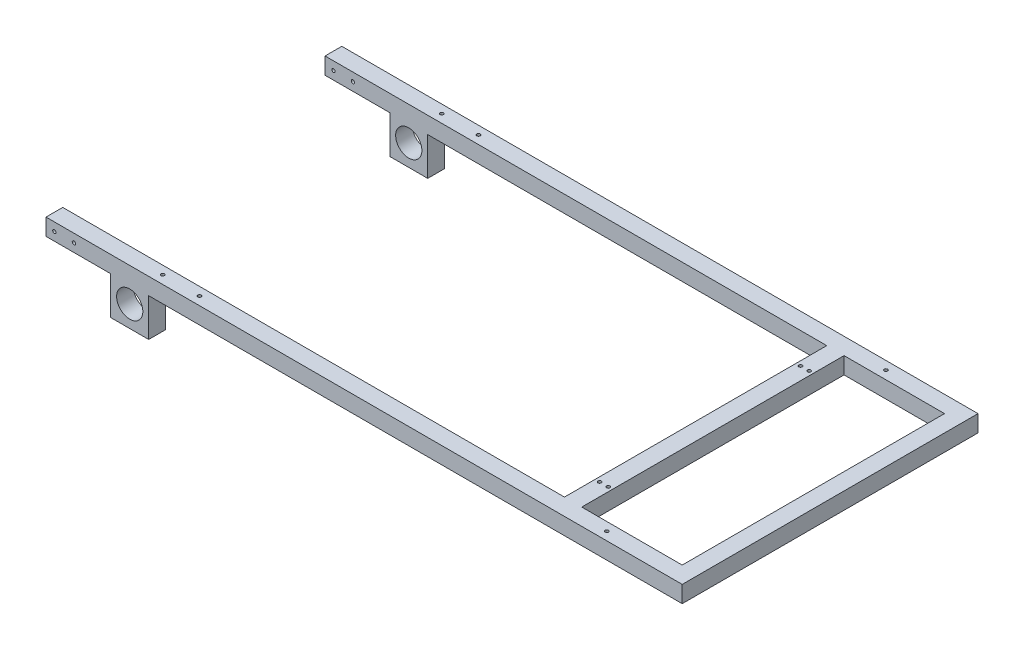
ISO-10303-21;
HEADER;
FILE_DESCRIPTION(('STEP AP214'),'2;1');
FILE_NAME('part.step','',(''),(''),'','','');
FILE_SCHEMA(('AUTOMOTIVE_DESIGN { 1 0 10303 214 1 1 1 1 }'));
ENDSEC;
DATA;
#1=APPLICATION_CONTEXT('core data for automotive mechanical design processes');
#2=APPLICATION_PROTOCOL_DEFINITION('international standard','automotive_design',2000,#1);
#3=PRODUCT_CONTEXT('',#1,'mechanical');
#4=PRODUCT('Part','Part','',(#3));
#5=PRODUCT_RELATED_PRODUCT_CATEGORY('part','',(#4));
#6=PRODUCT_DEFINITION_FORMATION('','',#4);
#7=PRODUCT_DEFINITION_CONTEXT('part definition',#1,'design');
#8=PRODUCT_DEFINITION('design','',#6,#7);
#9=PRODUCT_DEFINITION_SHAPE('','',#8);
#10=(LENGTH_UNIT() NAMED_UNIT(*) SI_UNIT(.MILLI.,.METRE.));
#11=(NAMED_UNIT(*) PLANE_ANGLE_UNIT() SI_UNIT($,.RADIAN.));
#12=(NAMED_UNIT(*) SI_UNIT($,.STERADIAN.) SOLID_ANGLE_UNIT());
#13=UNCERTAINTY_MEASURE_WITH_UNIT(LENGTH_MEASURE(1.E-05),#10,'distance_accuracy_value','');
#14=(GEOMETRIC_REPRESENTATION_CONTEXT(3) GLOBAL_UNCERTAINTY_ASSIGNED_CONTEXT((#13)) GLOBAL_UNIT_ASSIGNED_CONTEXT((#10,
#11,#12)) REPRESENTATION_CONTEXT('',''));
#15=CARTESIAN_POINT('',(0.,0.,0.));
#16=DIRECTION('',(0.,0.,1.));
#17=DIRECTION('',(1.,0.,0.));
#18=AXIS2_PLACEMENT_3D('',#15,#16,#17);
#19=CARTESIAN_POINT('',(0.,0.,0.));
#20=DIRECTION('',(0.,1.,0.));
#21=DIRECTION('',(0.,0.,1.));
#22=AXIS2_PLACEMENT_3D('',#19,#20,#21);
#23=PLANE('',#22);
#24=DIRECTION('',(1.,0.,0.));
#25=VECTOR('',#24,1.);
#26=CARTESIAN_POINT('',(-989.999999999999,0.,265.));
#27=LINE('',#26,#25);
#28=CARTESIAN_POINT('',(-150.,0.,265.));
#29=VERTEX_POINT('',#28);
#30=CARTESIAN_POINT('',(-34.,0.,265.));
#31=VERTEX_POINT('',#30);
#32=EDGE_CURVE('E205',#29,#31,#27,.T.);
#33=ORIENTED_EDGE('',*,*,#32,.F.);
#34=DIRECTION('',(0.,0.,1.));
#35=VECTOR('',#34,1.);
#36=CARTESIAN_POINT('',(-150.,0.,-265.));
#37=LINE('',#36,#35);
#38=CARTESIAN_POINT('',(-150.,0.,235.));
#39=VERTEX_POINT('',#38);
#40=EDGE_CURVE('E61',#39,#29,#37,.T.);
#41=ORIENTED_EDGE('',*,*,#40,.F.);
#42=DIRECTION('',(1.,0.,0.));
#43=VECTOR('',#42,1.);
#44=CARTESIAN_POINT('',(-959.999999999999,0.,235.));
#45=LINE('',#44,#43);
#46=CARTESIAN_POINT('',(-34.,0.,235.));
#47=VERTEX_POINT('',#46);
#48=EDGE_CURVE('E341',#39,#47,#45,.T.);
#49=ORIENTED_EDGE('',*,*,#48,.T.);
#50=DIRECTION('',(0.,0.,-1.));
#51=VECTOR('',#50,1.);
#52=CARTESIAN_POINT('',(-34.,0.,265.));
#53=LINE('',#52,#51);
#54=EDGE_CURVE('E310',#31,#47,#53,.T.);
#55=ORIENTED_EDGE('',*,*,#54,.F.);
#56=EDGE_LOOP('',(#33,#41,#49,#55));
#57=FACE_BOUND('',#56,.T.);
#58=ADVANCED_FACE('F36',(#57),#23,.F.);
#59=CARTESIAN_POINT('',(-959.999999999999,30.,-235.));
#60=DIRECTION('',(0.,0.,1.));
#61=DIRECTION('',(1.,0.,0.));
#62=AXIS2_PLACEMENT_3D('',#59,#60,#61);
#63=PLANE('',#62);
#64=CARTESIAN_POINT('',(-135.,15.,-235.));
#65=DIRECTION('',(0.,0.,1.));
#66=DIRECTION('',(1.,0.,0.));
#67=AXIS2_PLACEMENT_3D('',#64,#65,#66);
#68=CIRCLE('',#67,2.99999999999999);
#69=CARTESIAN_POINT('',(-132.,15.,-235.));
#70=VERTEX_POINT('',#69);
#71=EDGE_CURVE('E853',#70,#70,#68,.T.);
#72=ORIENTED_EDGE('',*,*,#71,.F.);
#73=EDGE_LOOP('',(#72));
#74=FACE_BOUND('',#73,.T.);
#75=CARTESIAN_POINT('',(-100.,15.,-235.));
#76=DIRECTION('',(0.,0.,1.));
#77=DIRECTION('',(1.,0.,0.));
#78=AXIS2_PLACEMENT_3D('',#75,#76,#77);
#79=CIRCLE('',#78,2.99999999999999);
#80=CARTESIAN_POINT('',(-97.,15.,-235.));
#81=VERTEX_POINT('',#80);
#82=EDGE_CURVE('E507',#81,#81,#79,.T.);
#83=ORIENTED_EDGE('',*,*,#82,.F.);
#84=EDGE_LOOP('',(#83));
#85=FACE_BOUND('',#84,.T.);
#86=DIRECTION('',(0.,1.,0.));
#87=VECTOR('',#86,1.);
#88=CARTESIAN_POINT('',(-150.,30.,-235.));
#89=LINE('',#88,#87);
#90=CARTESIAN_POINT('',(-150.,0.,-235.));
#91=VERTEX_POINT('',#90);
#92=CARTESIAN_POINT('',(-150.,30.,-235.));
#93=VERTEX_POINT('',#92);
#94=EDGE_CURVE('E229',#91,#93,#89,.T.);
#95=ORIENTED_EDGE('',*,*,#94,.F.);
#96=DIRECTION('',(-1.,0.,0.));
#97=VECTOR('',#96,1.);
#98=CARTESIAN_POINT('',(-959.999999999999,0.,-235.));
#99=LINE('',#98,#97);
#100=CARTESIAN_POINT('',(-34.,0.,-235.));
#101=VERTEX_POINT('',#100);
#102=EDGE_CURVE('E188',#101,#91,#99,.T.);
#103=ORIENTED_EDGE('',*,*,#102,.F.);
#104=DIRECTION('',(0.,1.,0.));
#105=VECTOR('',#104,1.);
#106=CARTESIAN_POINT('',(-34.,-68.,-235.));
#107=LINE('',#106,#105);
#108=CARTESIAN_POINT('',(-34.,-68.,-235.));
#109=VERTEX_POINT('',#108);
#110=EDGE_CURVE('E297',#109,#101,#107,.T.);
#111=ORIENTED_EDGE('',*,*,#110,.F.);
#112=DIRECTION('',(-1.,0.,0.));
#113=VECTOR('',#112,1.);
#114=CARTESIAN_POINT('',(-34.,-68.,-235.));
#115=LINE('',#114,#113);
#116=CARTESIAN_POINT('',(34.,-68.,-235.));
#117=VERTEX_POINT('',#116);
#118=EDGE_CURVE('E295',#117,#109,#115,.T.);
#119=ORIENTED_EDGE('',*,*,#118,.F.);
#120=DIRECTION('',(0.,1.,0.));
#121=VECTOR('',#120,1.);
#122=CARTESIAN_POINT('',(34.,-68.,-235.));
#123=LINE('',#122,#121);
#124=CARTESIAN_POINT('',(33.9999999999999,0.,-235.));
#125=VERTEX_POINT('',#124);
#126=EDGE_CURVE('E303',#117,#125,#123,.T.);
#127=ORIENTED_EDGE('',*,*,#126,.T.);
#128=CARTESIAN_POINT('',(749.000000000001,0.,-235.));
#129=VERTEX_POINT('',#128);
#130=EDGE_CURVE('E355',#129,#125,#99,.T.);
#131=ORIENTED_EDGE('',*,*,#130,.F.);
#132=DIRECTION('',(0.,1.,0.));
#133=VECTOR('',#132,1.);
#134=CARTESIAN_POINT('',(749.000000000001,-471.021230943999,-235.));
#135=LINE('',#134,#133);
#136=CARTESIAN_POINT('',(749.000000000001,30.,-235.));
#137=VERTEX_POINT('',#136);
#138=EDGE_CURVE('E261',#129,#137,#135,.T.);
#139=ORIENTED_EDGE('',*,*,#138,.T.);
#140=DIRECTION('',(-1.,0.,0.));
#141=VECTOR('',#140,1.);
#142=CARTESIAN_POINT('',(-959.999999999999,30.,-235.));
#143=LINE('',#142,#141);
#144=EDGE_CURVE('E340',#137,#93,#143,.T.);
#145=ORIENTED_EDGE('',*,*,#144,.T.);
#146=EDGE_LOOP('',(#95,#103,#111,#119,#127,#131,#139,#145));
#147=FACE_BOUND('',#146,.T.);
#148=CARTESIAN_POINT('',(0.,-30.,-235.));
#149=DIRECTION('',(0.,0.,1.));
#150=DIRECTION('',(1.,0.,0.));
#151=AXIS2_PLACEMENT_3D('',#148,#149,#150);
#152=CIRCLE('',#151,23.5);
#153=CARTESIAN_POINT('',(23.5,-30.,-235.));
#154=VERTEX_POINT('',#153);
#155=EDGE_CURVE('E213',#154,#154,#152,.T.);
#156=ORIENTED_EDGE('',*,*,#155,.F.);
#157=EDGE_LOOP('',(#156));
#158=FACE_BOUND('',#157,.T.);
#159=ADVANCED_FACE('F384',(#74,#85,#147,#158),#63,.T.);
#160=CARTESIAN_POINT('',(-959.999999999999,30.,235.));
#161=DIRECTION('',(0.,0.,-1.));
#162=DIRECTION('',(-1.,0.,0.));
#163=AXIS2_PLACEMENT_3D('',#160,#161,#162);
#164=PLANE('',#163);
#165=CARTESIAN_POINT('',(-135.,15.,235.));
#166=DIRECTION('',(0.,0.,-1.));
#167=DIRECTION('',(-1.,0.,0.));
#168=AXIS2_PLACEMENT_3D('',#165,#166,#167);
#169=CIRCLE('',#168,2.99999999999999);
#170=CARTESIAN_POINT('',(-138.,15.,235.));
#171=VERTEX_POINT('',#170);
#172=EDGE_CURVE('E846',#171,#171,#169,.T.);
#173=ORIENTED_EDGE('',*,*,#172,.F.);
#174=EDGE_LOOP('',(#173));
#175=FACE_BOUND('',#174,.T.);
#176=CARTESIAN_POINT('',(-100.,15.,235.));
#177=DIRECTION('',(0.,0.,-1.));
#178=DIRECTION('',(-1.,0.,0.));
#179=AXIS2_PLACEMENT_3D('',#176,#177,#178);
#180=CIRCLE('',#179,2.99999999999999);
#181=CARTESIAN_POINT('',(-103.,15.,235.));
#182=VERTEX_POINT('',#181);
#183=EDGE_CURVE('E503',#182,#182,#180,.T.);
#184=ORIENTED_EDGE('',*,*,#183,.F.);
#185=EDGE_LOOP('',(#184));
#186=FACE_BOUND('',#185,.T.);
#187=DIRECTION('',(0.,-1.,0.));
#188=VECTOR('',#187,1.);
#189=CARTESIAN_POINT('',(-150.,30.,235.));
#190=LINE('',#189,#188);
#191=CARTESIAN_POINT('',(-150.,30.,235.));
#192=VERTEX_POINT('',#191);
#193=EDGE_CURVE('E381',#192,#39,#190,.T.);
#194=ORIENTED_EDGE('',*,*,#193,.F.);
#195=DIRECTION('',(1.,0.,0.));
#196=VECTOR('',#195,1.);
#197=CARTESIAN_POINT('',(-959.999999999999,30.,235.));
#198=LINE('',#197,#196);
#199=CARTESIAN_POINT('',(749.000000000001,30.,235.));
#200=VERTEX_POINT('',#199);
#201=EDGE_CURVE('E346',#192,#200,#198,.T.);
#202=ORIENTED_EDGE('',*,*,#201,.T.);
#203=DIRECTION('',(0.,1.,0.));
#204=VECTOR('',#203,1.);
#205=CARTESIAN_POINT('',(749.000000000001,-471.021230943999,235.));
#206=LINE('',#205,#204);
#207=CARTESIAN_POINT('',(749.000000000001,0.,235.));
#208=VERTEX_POINT('',#207);
#209=EDGE_CURVE('E270',#208,#200,#206,.T.);
#210=ORIENTED_EDGE('',*,*,#209,.F.);
#211=CARTESIAN_POINT('',(33.9999999999999,0.,235.));
#212=VERTEX_POINT('',#211);
#213=EDGE_CURVE('E357',#212,#208,#45,.T.);
#214=ORIENTED_EDGE('',*,*,#213,.F.);
#215=DIRECTION('',(0.,1.,0.));
#216=VECTOR('',#215,1.);
#217=CARTESIAN_POINT('',(33.9999999999999,-68.,235.));
#218=LINE('',#217,#216);
#219=CARTESIAN_POINT('',(33.9999999999999,-68.,235.));
#220=VERTEX_POINT('',#219);
#221=EDGE_CURVE('E331',#220,#212,#218,.T.);
#222=ORIENTED_EDGE('',*,*,#221,.F.);
#223=DIRECTION('',(1.,0.,0.));
#224=VECTOR('',#223,1.);
#225=CARTESIAN_POINT('',(-34.,-68.,235.));
#226=LINE('',#225,#224);
#227=CARTESIAN_POINT('',(-34.,-68.,235.));
#228=VERTEX_POINT('',#227);
#229=EDGE_CURVE('E314',#228,#220,#226,.T.);
#230=ORIENTED_EDGE('',*,*,#229,.F.);
#231=DIRECTION('',(0.,1.,0.));
#232=VECTOR('',#231,1.);
#233=CARTESIAN_POINT('',(-34.,-68.,235.));
#234=LINE('',#233,#232);
#235=EDGE_CURVE('E334',#228,#47,#234,.T.);
#236=ORIENTED_EDGE('',*,*,#235,.T.);
#237=ORIENTED_EDGE('',*,*,#48,.F.);
#238=EDGE_LOOP('',(#194,#202,#210,#214,#222,#230,#236,#237));
#239=FACE_BOUND('',#238,.T.);
#240=CARTESIAN_POINT('',(0.,-30.,235.));
#241=DIRECTION('',(0.,0.,-1.));
#242=DIRECTION('',(-1.,0.,0.));
#243=AXIS2_PLACEMENT_3D('',#240,#241,#242);
#244=CIRCLE('',#243,23.5);
#245=CARTESIAN_POINT('',(-23.5,-30.,235.));
#246=VERTEX_POINT('',#245);
#247=EDGE_CURVE('E211',#246,#246,#244,.T.);
#248=ORIENTED_EDGE('',*,*,#247,.F.);
#249=EDGE_LOOP('',(#248));
#250=FACE_BOUND('',#249,.T.);
#251=ADVANCED_FACE('F434',(#175,#186,#239,#250),#164,.T.);
#252=ORIENTED_EDGE('',*,*,#102,.T.);
#253=CARTESIAN_POINT('',(-150.,0.,-265.));
#254=VERTEX_POINT('',#253);
#255=EDGE_CURVE('E175',#254,#91,#37,.T.);
#256=ORIENTED_EDGE('',*,*,#255,.F.);
#257=DIRECTION('',(-1.,0.,0.));
#258=VECTOR('',#257,1.);
#259=CARTESIAN_POINT('',(-990.,0.,-265.));
#260=LINE('',#259,#258);
#261=CARTESIAN_POINT('',(-34.,0.,-265.));
#262=VERTEX_POINT('',#261);
#263=EDGE_CURVE('E186',#262,#254,#260,.T.);
#264=ORIENTED_EDGE('',*,*,#263,.F.);
#265=DIRECTION('',(0.,0.,-1.));
#266=VECTOR('',#265,1.);
#267=CARTESIAN_POINT('',(-34.,0.,-235.));
#268=LINE('',#267,#266);
#269=EDGE_CURVE('E286',#101,#262,#268,.T.);
#270=ORIENTED_EDGE('',*,*,#269,.F.);
#271=EDGE_LOOP('',(#252,#256,#264,#270));
#272=FACE_BOUND('',#271,.T.);
#273=ADVANCED_FACE('F184',(#272),#23,.F.);
#274=CARTESIAN_POINT('',(43.9999999999996,0.,-250.));
#275=DIRECTION('',(0.,1.,0.));
#276=DIRECTION('',(0.,0.,1.));
#277=AXIS2_PLACEMENT_3D('',#274,#275,#276);
#278=CIRCLE('',#277,2.99999999999999);
#279=CARTESIAN_POINT('',(43.9999999999996,0.,-247.));
#280=VERTEX_POINT('',#279);
#281=EDGE_CURVE('E856',#280,#280,#278,.T.);
#282=ORIENTED_EDGE('',*,*,#281,.T.);
#283=EDGE_LOOP('',(#282));
#284=FACE_BOUND('',#283,.T.);
#285=CARTESIAN_POINT('',(110.,0.,-250.));
#286=DIRECTION('',(0.,1.,0.));
#287=DIRECTION('',(0.,0.,1.));
#288=AXIS2_PLACEMENT_3D('',#285,#286,#287);
#289=CIRCLE('',#288,3.00000000000001);
#290=CARTESIAN_POINT('',(110.,0.,-247.));
#291=VERTEX_POINT('',#290);
#292=EDGE_CURVE('E858',#291,#291,#289,.T.);
#293=ORIENTED_EDGE('',*,*,#292,.T.);
#294=EDGE_LOOP('',(#293));
#295=FACE_BOUND('',#294,.T.);
#296=CARTESIAN_POINT('',(43.9999999999996,0.,250.));
#297=DIRECTION('',(0.,-1.,0.));
#298=DIRECTION('',(0.,0.,-1.));
#299=AXIS2_PLACEMENT_3D('',#296,#297,#298);
#300=CIRCLE('',#299,2.99999999999999);
#301=CARTESIAN_POINT('',(43.9999999999996,0.,247.));
#302=VERTEX_POINT('',#301);
#303=EDGE_CURVE('E499',#302,#302,#300,.T.);
#304=ORIENTED_EDGE('',*,*,#303,.F.);
#305=EDGE_LOOP('',(#304));
#306=FACE_BOUND('',#305,.T.);
#307=CARTESIAN_POINT('',(110.,0.,250.));
#308=DIRECTION('',(0.,-1.,0.));
#309=DIRECTION('',(0.,0.,-1.));
#310=AXIS2_PLACEMENT_3D('',#307,#308,#309);
#311=CIRCLE('',#310,3.00000000000001);
#312=CARTESIAN_POINT('',(110.,0.,247.));
#313=VERTEX_POINT('',#312);
#314=EDGE_CURVE('E491',#313,#313,#311,.T.);
#315=ORIENTED_EDGE('',*,*,#314,.F.);
#316=EDGE_LOOP('',(#315));
#317=FACE_BOUND('',#316,.T.);
#318=CARTESIAN_POINT('',(840.000000000001,0.,-250.));
#319=DIRECTION('',(0.,1.,0.));
#320=DIRECTION('',(0.,0.,1.));
#321=AXIS2_PLACEMENT_3D('',#318,#319,#320);
#322=CIRCLE('',#321,3.00000000000005);
#323=CARTESIAN_POINT('',(840.000000000001,0.,-247.));
#324=VERTEX_POINT('',#323);
#325=EDGE_CURVE('E218',#324,#324,#322,.F.);
#326=ORIENTED_EDGE('',*,*,#325,.F.);
#327=EDGE_LOOP('',(#326));
#328=FACE_BOUND('',#327,.T.);
#329=CARTESIAN_POINT('',(840.000000000001,0.,250.));
#330=DIRECTION('',(0.,1.,0.));
#331=DIRECTION('',(0.,0.,1.));
#332=AXIS2_PLACEMENT_3D('',#329,#330,#331);
#333=CIRCLE('',#332,3.00000000000005);
#334=CARTESIAN_POINT('',(840.000000000001,0.,253.));
#335=VERTEX_POINT('',#334);
#336=EDGE_CURVE('E217',#335,#335,#333,.T.);
#337=ORIENTED_EDGE('',*,*,#336,.T.);
#338=EDGE_LOOP('',(#337));
#339=FACE_BOUND('',#338,.T.);
#340=CARTESIAN_POINT('',(772.500000000001,0.,-180.));
#341=DIRECTION('',(0.,1.,0.));
#342=DIRECTION('',(0.,0.,1.));
#343=AXIS2_PLACEMENT_3D('',#340,#341,#342);
#344=CIRCLE('',#343,3.00000000000005);
#345=CARTESIAN_POINT('',(772.500000000001,0.,-177.));
#346=VERTEX_POINT('',#345);
#347=EDGE_CURVE('E247',#346,#346,#344,.T.);
#348=ORIENTED_EDGE('',*,*,#347,.T.);
#349=EDGE_LOOP('',(#348));
#350=FACE_BOUND('',#349,.T.);
#351=CARTESIAN_POINT('',(757.000000000001,0.,180.));
#352=DIRECTION('',(0.,1.,0.));
#353=DIRECTION('',(0.,0.,1.));
#354=AXIS2_PLACEMENT_3D('',#351,#352,#353);
#355=CIRCLE('',#354,3.00000000000005);
#356=CARTESIAN_POINT('',(757.000000000001,0.,183.));
#357=VERTEX_POINT('',#356);
#358=EDGE_CURVE('E244',#357,#357,#355,.T.);
#359=ORIENTED_EDGE('',*,*,#358,.T.);
#360=EDGE_LOOP('',(#359));
#361=FACE_BOUND('',#360,.T.);
#362=CARTESIAN_POINT('',(772.500000000001,0.,180.));
#363=DIRECTION('',(0.,1.,0.));
#364=DIRECTION('',(0.,0.,1.));
#365=AXIS2_PLACEMENT_3D('',#362,#363,#364);
#366=CIRCLE('',#365,3.00000000000005);
#367=CARTESIAN_POINT('',(772.500000000001,0.,183.));
#368=VERTEX_POINT('',#367);
#369=EDGE_CURVE('E236',#368,#368,#366,.T.);
#370=ORIENTED_EDGE('',*,*,#369,.T.);
#371=EDGE_LOOP('',(#370));
#372=FACE_BOUND('',#371,.T.);
#373=CARTESIAN_POINT('',(757.000000000001,0.,-180.));
#374=DIRECTION('',(0.,1.,0.));
#375=DIRECTION('',(0.,0.,1.));
#376=AXIS2_PLACEMENT_3D('',#373,#374,#375);
#377=CIRCLE('',#376,3.00000000000005);
#378=CARTESIAN_POINT('',(757.000000000001,0.,-177.));
#379=VERTEX_POINT('',#378);
#380=EDGE_CURVE('E253',#379,#379,#377,.T.);
#381=ORIENTED_EDGE('',*,*,#380,.T.);
#382=EDGE_LOOP('',(#381));
#383=FACE_BOUND('',#382,.T.);
#384=CARTESIAN_POINT('',(960.000000000001,0.,-235.));
#385=VERTEX_POINT('',#384);
#386=CARTESIAN_POINT('',(780.000000000001,0.,-235.));
#387=VERTEX_POINT('',#386);
#388=EDGE_CURVE('E351',#385,#387,#99,.T.);
#389=ORIENTED_EDGE('',*,*,#388,.T.);
#390=DIRECTION('',(0.,0.,1.));
#391=VECTOR('',#390,1.);
#392=CARTESIAN_POINT('',(780.000000000001,0.,-235.));
#393=LINE('',#392,#391);
#394=CARTESIAN_POINT('',(780.000000000001,0.,235.));
#395=VERTEX_POINT('',#394);
#396=EDGE_CURVE('E257',#387,#395,#393,.T.);
#397=ORIENTED_EDGE('',*,*,#396,.T.);
#398=CARTESIAN_POINT('',(960.000000000001,0.,235.));
#399=VERTEX_POINT('',#398);
#400=EDGE_CURVE('E354',#395,#399,#45,.T.);
#401=ORIENTED_EDGE('',*,*,#400,.T.);
#402=DIRECTION('',(0.,0.,-1.));
#403=VECTOR('',#402,1.);
#404=CARTESIAN_POINT('',(960.000000000001,0.,-235.));
#405=LINE('',#404,#403);
#406=EDGE_CURVE('E337',#399,#385,#405,.T.);
#407=ORIENTED_EDGE('',*,*,#406,.T.);
#408=EDGE_LOOP('',(#389,#397,#401,#407));
#409=FACE_BOUND('',#408,.T.);
#410=DIRECTION('',(0.,0.,1.));
#411=VECTOR('',#410,1.);
#412=CARTESIAN_POINT('',(34.,0.,-235.));
#413=LINE('',#412,#411);
#414=CARTESIAN_POINT('',(34.,0.,-265.));
#415=VERTEX_POINT('',#414);
#416=EDGE_CURVE('E291',#415,#125,#413,.T.);
#417=ORIENTED_EDGE('',*,*,#416,.F.);
#418=CARTESIAN_POINT('',(990.,0.,-265.));
#419=VERTEX_POINT('',#418);
#420=EDGE_CURVE('E195',#419,#415,#260,.T.);
#421=ORIENTED_EDGE('',*,*,#420,.F.);
#422=DIRECTION('',(0.,0.,-1.));
#423=VECTOR('',#422,1.);
#424=CARTESIAN_POINT('',(990.,0.,-265.));
#425=LINE('',#424,#423);
#426=CARTESIAN_POINT('',(990.000000000001,0.,265.));
#427=VERTEX_POINT('',#426);
#428=EDGE_CURVE('E196',#427,#419,#425,.T.);
#429=ORIENTED_EDGE('',*,*,#428,.F.);
#430=CARTESIAN_POINT('',(34.,0.,265.));
#431=VERTEX_POINT('',#430);
#432=EDGE_CURVE('E199',#431,#427,#27,.T.);
#433=ORIENTED_EDGE('',*,*,#432,.F.);
#434=DIRECTION('',(0.,0.,1.));
#435=VECTOR('',#434,1.);
#436=CARTESIAN_POINT('',(34.,0.,265.));
#437=LINE('',#436,#435);
#438=EDGE_CURVE('E315',#212,#431,#437,.T.);
#439=ORIENTED_EDGE('',*,*,#438,.F.);
#440=ORIENTED_EDGE('',*,*,#213,.T.);
#441=DIRECTION('',(0.,0.,-1.));
#442=VECTOR('',#441,1.);
#443=CARTESIAN_POINT('',(749.000000000001,0.,-235.));
#444=LINE('',#443,#442);
#445=EDGE_CURVE('E260',#208,#129,#444,.T.);
#446=ORIENTED_EDGE('',*,*,#445,.T.);
#447=ORIENTED_EDGE('',*,*,#130,.T.);
#448=EDGE_LOOP('',(#417,#421,#429,#433,#439,#440,#446,#447));
#449=FACE_BOUND('',#448,.T.);
#450=ADVANCED_FACE('F392',(#284,#295,#306,#317,#328,#339,#350,#361,#372,#383,#409,#449),#23,.F.);
#451=CARTESIAN_POINT('',(0.,30.,0.));
#452=DIRECTION('',(0.,1.,0.));
#453=DIRECTION('',(0.,0.,1.));
#454=AXIS2_PLACEMENT_3D('',#451,#452,#453);
#455=PLANE('',#454);
#456=CARTESIAN_POINT('',(43.9999999999996,30.,-250.));
#457=DIRECTION('',(0.,1.,0.));
#458=DIRECTION('',(0.,0.,1.));
#459=AXIS2_PLACEMENT_3D('',#456,#457,#458);
#460=CIRCLE('',#459,2.99999999999999);
#461=CARTESIAN_POINT('',(43.9999999999996,30.,-247.));
#462=VERTEX_POINT('',#461);
#463=EDGE_CURVE('E477',#462,#462,#460,.T.);
#464=ORIENTED_EDGE('',*,*,#463,.F.);
#465=EDGE_LOOP('',(#464));
#466=FACE_BOUND('',#465,.T.);
#467=CARTESIAN_POINT('',(110.,30.,-250.));
#468=DIRECTION('',(0.,1.,0.));
#469=DIRECTION('',(0.,0.,1.));
#470=AXIS2_PLACEMENT_3D('',#467,#468,#469);
#471=CIRCLE('',#470,3.00000000000001);
#472=CARTESIAN_POINT('',(110.,30.,-247.));
#473=VERTEX_POINT('',#472);
#474=EDGE_CURVE('E481',#473,#473,#471,.T.);
#475=ORIENTED_EDGE('',*,*,#474,.F.);
#476=EDGE_LOOP('',(#475));
#477=FACE_BOUND('',#476,.T.);
#478=CARTESIAN_POINT('',(43.9999999999996,30.,250.));
#479=DIRECTION('',(0.,-1.,0.));
#480=DIRECTION('',(0.,0.,-1.));
#481=AXIS2_PLACEMENT_3D('',#478,#479,#480);
#482=CIRCLE('',#481,2.99999999999999);
#483=CARTESIAN_POINT('',(43.9999999999996,30.,247.));
#484=VERTEX_POINT('',#483);
#485=EDGE_CURVE('E485',#484,#484,#482,.T.);
#486=ORIENTED_EDGE('',*,*,#485,.T.);
#487=EDGE_LOOP('',(#486));
#488=FACE_BOUND('',#487,.T.);
#489=CARTESIAN_POINT('',(110.,30.,250.));
#490=DIRECTION('',(0.,-1.,0.));
#491=DIRECTION('',(0.,0.,-1.));
#492=AXIS2_PLACEMENT_3D('',#489,#490,#491);
#493=CIRCLE('',#492,3.00000000000001);
#494=CARTESIAN_POINT('',(110.,30.,247.));
#495=VERTEX_POINT('',#494);
#496=EDGE_CURVE('E488',#495,#495,#493,.T.);
#497=ORIENTED_EDGE('',*,*,#496,.T.);
#498=EDGE_LOOP('',(#497));
#499=FACE_BOUND('',#498,.T.);
#500=DIRECTION('',(0.,0.,1.));
#501=VECTOR('',#500,1.);
#502=CARTESIAN_POINT('',(-150.,30.,-265.));
#503=LINE('',#502,#501);
#504=CARTESIAN_POINT('',(-150.,30.,265.));
#505=VERTEX_POINT('',#504);
#506=EDGE_CURVE('E189',#192,#505,#503,.T.);
#507=ORIENTED_EDGE('',*,*,#506,.T.);
#508=DIRECTION('',(1.,0.,0.));
#509=VECTOR('',#508,1.);
#510=CARTESIAN_POINT('',(-989.999999999999,30.,265.));
#511=LINE('',#510,#509);
#512=CARTESIAN_POINT('',(990.000000000001,30.,265.));
#513=VERTEX_POINT('',#512);
#514=EDGE_CURVE('E209',#505,#513,#511,.T.);
#515=ORIENTED_EDGE('',*,*,#514,.T.);
#516=DIRECTION('',(0.,0.,-1.));
#517=VECTOR('',#516,1.);
#518=CARTESIAN_POINT('',(990.,30.,-265.));
#519=LINE('',#518,#517);
#520=CARTESIAN_POINT('',(990.,30.,-265.));
#521=VERTEX_POINT('',#520);
#522=EDGE_CURVE('E207',#513,#521,#519,.T.);
#523=ORIENTED_EDGE('',*,*,#522,.T.);
#524=DIRECTION('',(-1.,0.,0.));
#525=VECTOR('',#524,1.);
#526=CARTESIAN_POINT('',(-990.,30.,-265.));
#527=LINE('',#526,#525);
#528=CARTESIAN_POINT('',(-150.,30.,-265.));
#529=VERTEX_POINT('',#528);
#530=EDGE_CURVE('E364',#521,#529,#527,.T.);
#531=ORIENTED_EDGE('',*,*,#530,.T.);
#532=EDGE_CURVE('E53',#529,#93,#503,.T.);
#533=ORIENTED_EDGE('',*,*,#532,.T.);
#534=ORIENTED_EDGE('',*,*,#144,.F.);
#535=DIRECTION('',(0.,0.,1.));
#536=VECTOR('',#535,1.);
#537=CARTESIAN_POINT('',(749.000000000001,30.,-235.));
#538=LINE('',#537,#536);
#539=EDGE_CURVE('E256',#137,#200,#538,.T.);
#540=ORIENTED_EDGE('',*,*,#539,.T.);
#541=ORIENTED_EDGE('',*,*,#201,.F.);
#542=EDGE_LOOP('',(#507,#515,#523,#531,#533,#534,#540,#541));
#543=FACE_BOUND('',#542,.T.);
#544=CARTESIAN_POINT('',(840.000000000001,30.,-250.));
#545=DIRECTION('',(0.,1.,0.));
#546=DIRECTION('',(0.,0.,1.));
#547=AXIS2_PLACEMENT_3D('',#544,#545,#546);
#548=CIRCLE('',#547,3.00000000000005);
#549=CARTESIAN_POINT('',(840.000000000001,30.,-247.));
#550=VERTEX_POINT('',#549);
#551=EDGE_CURVE('E40',#550,#550,#548,.F.);
#552=ORIENTED_EDGE('',*,*,#551,.T.);
#553=EDGE_LOOP('',(#552));
#554=FACE_BOUND('',#553,.T.);
#555=CARTESIAN_POINT('',(840.000000000001,30.,250.));
#556=DIRECTION('',(0.,1.,0.));
#557=DIRECTION('',(0.,0.,1.));
#558=AXIS2_PLACEMENT_3D('',#555,#556,#557);
#559=CIRCLE('',#558,3.00000000000005);
#560=CARTESIAN_POINT('',(840.000000000001,30.,253.));
#561=VERTEX_POINT('',#560);
#562=EDGE_CURVE('E215',#561,#561,#559,.T.);
#563=ORIENTED_EDGE('',*,*,#562,.F.);
#564=EDGE_LOOP('',(#563));
#565=FACE_BOUND('',#564,.T.);
#566=CARTESIAN_POINT('',(772.500000000001,30.,-180.));
#567=DIRECTION('',(0.,1.,0.));
#568=DIRECTION('',(0.,0.,1.));
#569=AXIS2_PLACEMENT_3D('',#566,#567,#568);
#570=CIRCLE('',#569,3.00000000000005);
#571=CARTESIAN_POINT('',(772.500000000001,30.,-177.));
#572=VERTEX_POINT('',#571);
#573=EDGE_CURVE('E233',#572,#572,#570,.T.);
#574=ORIENTED_EDGE('',*,*,#573,.F.);
#575=EDGE_LOOP('',(#574));
#576=FACE_BOUND('',#575,.T.);
#577=CARTESIAN_POINT('',(757.000000000001,30.,180.));
#578=DIRECTION('',(0.,1.,0.));
#579=DIRECTION('',(0.,0.,-1.));
#580=AXIS2_PLACEMENT_3D('',#577,#578,#579);
#581=CIRCLE('',#580,3.00000000000005);
#582=CARTESIAN_POINT('',(757.000000000001,30.,177.));
#583=VERTEX_POINT('',#582);
#584=EDGE_CURVE('E237',#583,#583,#581,.T.);
#585=ORIENTED_EDGE('',*,*,#584,.F.);
#586=EDGE_LOOP('',(#585));
#587=FACE_BOUND('',#586,.T.);
#588=CARTESIAN_POINT('',(772.500000000001,30.,180.));
#589=DIRECTION('',(0.,1.,0.));
#590=DIRECTION('',(0.,0.,-1.));
#591=AXIS2_PLACEMENT_3D('',#588,#589,#590);
#592=CIRCLE('',#591,3.00000000000005);
#593=CARTESIAN_POINT('',(772.500000000001,30.,177.));
#594=VERTEX_POINT('',#593);
#595=EDGE_CURVE('E222',#594,#594,#592,.T.);
#596=ORIENTED_EDGE('',*,*,#595,.F.);
#597=EDGE_LOOP('',(#596));
#598=FACE_BOUND('',#597,.T.);
#599=CARTESIAN_POINT('',(757.000000000001,30.,-180.));
#600=DIRECTION('',(0.,1.,0.));
#601=DIRECTION('',(0.,0.,1.));
#602=AXIS2_PLACEMENT_3D('',#599,#600,#601);
#603=CIRCLE('',#602,3.00000000000005);
#604=CARTESIAN_POINT('',(757.000000000001,30.,-177.));
#605=VERTEX_POINT('',#604);
#606=EDGE_CURVE('E250',#605,#605,#603,.T.);
#607=ORIENTED_EDGE('',*,*,#606,.F.);
#608=EDGE_LOOP('',(#607));
#609=FACE_BOUND('',#608,.T.);
#610=CARTESIAN_POINT('',(960.000000000001,30.,-235.));
#611=VERTEX_POINT('',#610);
#612=CARTESIAN_POINT('',(780.000000000001,30.,-235.));
#613=VERTEX_POINT('',#612);
#614=EDGE_CURVE('E342',#611,#613,#143,.T.);
#615=ORIENTED_EDGE('',*,*,#614,.F.);
#616=DIRECTION('',(0.,0.,-1.));
#617=VECTOR('',#616,1.);
#618=CARTESIAN_POINT('',(960.000000000001,30.,-235.));
#619=LINE('',#618,#617);
#620=CARTESIAN_POINT('',(960.000000000001,30.,235.));
#621=VERTEX_POINT('',#620);
#622=EDGE_CURVE('E338',#621,#611,#619,.T.);
#623=ORIENTED_EDGE('',*,*,#622,.F.);
#624=CARTESIAN_POINT('',(780.000000000001,30.,235.));
#625=VERTEX_POINT('',#624);
#626=EDGE_CURVE('E345',#625,#621,#198,.T.);
#627=ORIENTED_EDGE('',*,*,#626,.F.);
#628=DIRECTION('',(0.,0.,-1.));
#629=VECTOR('',#628,1.);
#630=CARTESIAN_POINT('',(780.000000000001,30.,-235.));
#631=LINE('',#630,#629);
#632=EDGE_CURVE('E267',#625,#613,#631,.T.);
#633=ORIENTED_EDGE('',*,*,#632,.T.);
#634=EDGE_LOOP('',(#615,#623,#627,#633));
#635=FACE_BOUND('',#634,.T.);
#636=ADVANCED_FACE('F369',(#466,#477,#488,#499,#543,#554,#565,#576,#587,#598,#609,#635),#455,.T.);
#637=CARTESIAN_POINT('',(990.,30.,-265.));
#638=DIRECTION('',(-1.,0.,0.));
#639=DIRECTION('',(0.,0.,1.));
#640=AXIS2_PLACEMENT_3D('',#637,#638,#639);
#641=PLANE('',#640);
#642=ORIENTED_EDGE('',*,*,#428,.T.);
#643=DIRECTION('',(0.,-1.,0.));
#644=VECTOR('',#643,1.);
#645=CARTESIAN_POINT('',(990.,30.,-265.));
#646=LINE('',#645,#644);
#647=EDGE_CURVE('E11',#521,#419,#646,.T.);
#648=ORIENTED_EDGE('',*,*,#647,.F.);
#649=ORIENTED_EDGE('',*,*,#522,.F.);
#650=DIRECTION('',(0.,-1.,0.));
#651=VECTOR('',#650,1.);
#652=CARTESIAN_POINT('',(990.000000000001,30.,265.));
#653=LINE('',#652,#651);
#654=EDGE_CURVE('E45',#513,#427,#653,.T.);
#655=ORIENTED_EDGE('',*,*,#654,.T.);
#656=EDGE_LOOP('',(#642,#648,#649,#655));
#657=FACE_BOUND('',#656,.T.);
#658=ADVANCED_FACE('F38',(#657),#641,.F.);
#659=CARTESIAN_POINT('',(-990.,30.,-265.));
#660=DIRECTION('',(0.,0.,1.));
#661=DIRECTION('',(1.,0.,0.));
#662=AXIS2_PLACEMENT_3D('',#659,#660,#661);
#663=PLANE('',#662);
#664=CARTESIAN_POINT('',(-135.,15.,-265.));
#665=DIRECTION('',(0.,0.,1.));
#666=DIRECTION('',(1.,0.,0.));
#667=AXIS2_PLACEMENT_3D('',#664,#665,#666);
#668=CIRCLE('',#667,2.99999999999999);
#669=CARTESIAN_POINT('',(-132.,15.,-265.));
#670=VERTEX_POINT('',#669);
#671=EDGE_CURVE('E847',#670,#670,#668,.T.);
#672=ORIENTED_EDGE('',*,*,#671,.T.);
#673=EDGE_LOOP('',(#672));
#674=FACE_BOUND('',#673,.T.);
#675=CARTESIAN_POINT('',(-100.,15.,-265.));
#676=DIRECTION('',(0.,0.,1.));
#677=DIRECTION('',(1.,0.,0.));
#678=AXIS2_PLACEMENT_3D('',#675,#676,#677);
#679=CIRCLE('',#678,2.99999999999999);
#680=CARTESIAN_POINT('',(-97.,15.,-265.));
#681=VERTEX_POINT('',#680);
#682=EDGE_CURVE('E494',#681,#681,#679,.T.);
#683=ORIENTED_EDGE('',*,*,#682,.T.);
#684=EDGE_LOOP('',(#683));
#685=FACE_BOUND('',#684,.T.);
#686=CARTESIAN_POINT('',(0.,-30.,-265.));
#687=DIRECTION('',(0.,0.,1.));
#688=DIRECTION('',(1.,0.,0.));
#689=AXIS2_PLACEMENT_3D('',#686,#687,#688);
#690=CIRCLE('',#689,23.5);
#691=CARTESIAN_POINT('',(23.5,-30.,-265.));
#692=VERTEX_POINT('',#691);
#693=EDGE_CURVE('E214',#692,#692,#690,.T.);
#694=ORIENTED_EDGE('',*,*,#693,.T.);
#695=EDGE_LOOP('',(#694));
#696=FACE_BOUND('',#695,.T.);
#697=ORIENTED_EDGE('',*,*,#263,.T.);
#698=DIRECTION('',(0.,1.,0.));
#699=VECTOR('',#698,1.);
#700=CARTESIAN_POINT('',(-150.,30.,-265.));
#701=LINE('',#700,#699);
#702=EDGE_CURVE('E172',#254,#529,#701,.T.);
#703=ORIENTED_EDGE('',*,*,#702,.T.);
#704=ORIENTED_EDGE('',*,*,#530,.F.);
#705=ORIENTED_EDGE('',*,*,#647,.T.);
#706=ORIENTED_EDGE('',*,*,#420,.T.);
#707=DIRECTION('',(0.,1.,0.));
#708=VECTOR('',#707,1.);
#709=CARTESIAN_POINT('',(34.,-68.,-265.));
#710=LINE('',#709,#708);
#711=CARTESIAN_POINT('',(34.,-68.,-265.));
#712=VERTEX_POINT('',#711);
#713=EDGE_CURVE('E306',#712,#415,#710,.T.);
#714=ORIENTED_EDGE('',*,*,#713,.F.);
#715=DIRECTION('',(1.,0.,0.));
#716=VECTOR('',#715,1.);
#717=CARTESIAN_POINT('',(-34.,-68.,-265.));
#718=LINE('',#717,#716);
#719=CARTESIAN_POINT('',(-34.,-68.,-265.));
#720=VERTEX_POINT('',#719);
#721=EDGE_CURVE('E290',#720,#712,#718,.T.);
#722=ORIENTED_EDGE('',*,*,#721,.F.);
#723=DIRECTION('',(0.,1.,0.));
#724=VECTOR('',#723,1.);
#725=CARTESIAN_POINT('',(-34.,-68.,-265.));
#726=LINE('',#725,#724);
#727=EDGE_CURVE('E193',#720,#262,#726,.T.);
#728=ORIENTED_EDGE('',*,*,#727,.T.);
#729=EDGE_LOOP('',(#697,#703,#704,#705,#706,#714,#722,#728));
#730=FACE_BOUND('',#729,.T.);
#731=ADVANCED_FACE('F191',(#674,#685,#696,#730),#663,.F.);
#732=CARTESIAN_POINT('',(-989.999999999999,30.,265.));
#733=DIRECTION('',(0.,0.,-1.));
#734=DIRECTION('',(-1.,0.,0.));
#735=AXIS2_PLACEMENT_3D('',#732,#733,#734);
#736=PLANE('',#735);
#737=CARTESIAN_POINT('',(-135.,15.,265.));
#738=DIRECTION('',(0.,0.,1.));
#739=DIRECTION('',(1.,0.,0.));
#740=AXIS2_PLACEMENT_3D('',#737,#738,#739);
#741=CIRCLE('',#740,2.99999999999999);
#742=CARTESIAN_POINT('',(-132.,15.,265.));
#743=VERTEX_POINT('',#742);
#744=EDGE_CURVE('E563',#743,#743,#741,.T.);
#745=ORIENTED_EDGE('',*,*,#744,.F.);
#746=EDGE_LOOP('',(#745));
#747=FACE_BOUND('',#746,.T.);
#748=CARTESIAN_POINT('',(-100.,15.,265.));
#749=DIRECTION('',(0.,0.,1.));
#750=DIRECTION('',(1.,0.,0.));
#751=AXIS2_PLACEMENT_3D('',#748,#749,#750);
#752=CIRCLE('',#751,2.99999999999999);
#753=CARTESIAN_POINT('',(-97.,15.,265.));
#754=VERTEX_POINT('',#753);
#755=EDGE_CURVE('E490',#754,#754,#752,.T.);
#756=ORIENTED_EDGE('',*,*,#755,.F.);
#757=EDGE_LOOP('',(#756));
#758=FACE_BOUND('',#757,.T.);
#759=CARTESIAN_POINT('',(0.,-30.,265.));
#760=DIRECTION('',(0.,0.,1.));
#761=DIRECTION('',(1.,0.,0.));
#762=AXIS2_PLACEMENT_3D('',#759,#760,#761);
#763=CIRCLE('',#762,23.5);
#764=CARTESIAN_POINT('',(23.5,-30.,265.));
#765=VERTEX_POINT('',#764);
#766=EDGE_CURVE('E264',#765,#765,#763,.T.);
#767=ORIENTED_EDGE('',*,*,#766,.F.);
#768=EDGE_LOOP('',(#767));
#769=FACE_BOUND('',#768,.T.);
#770=ORIENTED_EDGE('',*,*,#514,.F.);
#771=DIRECTION('',(0.,1.,0.));
#772=VECTOR('',#771,1.);
#773=CARTESIAN_POINT('',(-150.,30.,265.));
#774=LINE('',#773,#772);
#775=EDGE_CURVE('E180',#29,#505,#774,.T.);
#776=ORIENTED_EDGE('',*,*,#775,.F.);
#777=ORIENTED_EDGE('',*,*,#32,.T.);
#778=DIRECTION('',(0.,1.,0.));
#779=VECTOR('',#778,1.);
#780=CARTESIAN_POINT('',(-34.,-68.,265.));
#781=LINE('',#780,#779);
#782=CARTESIAN_POINT('',(-34.,-68.,265.));
#783=VERTEX_POINT('',#782);
#784=EDGE_CURVE('E321',#783,#31,#781,.T.);
#785=ORIENTED_EDGE('',*,*,#784,.F.);
#786=DIRECTION('',(-1.,0.,0.));
#787=VECTOR('',#786,1.);
#788=CARTESIAN_POINT('',(-34.,-68.,265.));
#789=LINE('',#788,#787);
#790=CARTESIAN_POINT('',(34.,-68.,265.));
#791=VERTEX_POINT('',#790);
#792=EDGE_CURVE('E319',#791,#783,#789,.T.);
#793=ORIENTED_EDGE('',*,*,#792,.F.);
#794=DIRECTION('',(0.,1.,0.));
#795=VECTOR('',#794,1.);
#796=CARTESIAN_POINT('',(34.,-68.,265.));
#797=LINE('',#796,#795);
#798=EDGE_CURVE('E328',#791,#431,#797,.T.);
#799=ORIENTED_EDGE('',*,*,#798,.T.);
#800=ORIENTED_EDGE('',*,*,#432,.T.);
#801=ORIENTED_EDGE('',*,*,#654,.F.);
#802=EDGE_LOOP('',(#770,#776,#777,#785,#793,#799,#800,#801));
#803=FACE_BOUND('',#802,.T.);
#804=ADVANCED_FACE('F375',(#747,#758,#769,#803),#736,.F.);
#805=CARTESIAN_POINT('',(960.000000000001,30.,-235.));
#806=DIRECTION('',(-1.,0.,0.));
#807=DIRECTION('',(0.,0.,1.));
#808=AXIS2_PLACEMENT_3D('',#805,#806,#807);
#809=PLANE('',#808);
#810=ORIENTED_EDGE('',*,*,#406,.F.);
#811=DIRECTION('',(0.,-1.,0.));
#812=VECTOR('',#811,1.);
#813=CARTESIAN_POINT('',(960.000000000001,30.,235.));
#814=LINE('',#813,#812);
#815=EDGE_CURVE('E348',#621,#399,#814,.T.);
#816=ORIENTED_EDGE('',*,*,#815,.F.);
#817=ORIENTED_EDGE('',*,*,#622,.T.);
#818=DIRECTION('',(0.,-1.,0.));
#819=VECTOR('',#818,1.);
#820=CARTESIAN_POINT('',(960.000000000001,30.,-235.));
#821=LINE('',#820,#819);
#822=EDGE_CURVE('E201',#611,#385,#821,.T.);
#823=ORIENTED_EDGE('',*,*,#822,.T.);
#824=EDGE_LOOP('',(#810,#816,#817,#823));
#825=FACE_BOUND('',#824,.T.);
#826=ADVANCED_FACE('F402',(#825),#809,.T.);
#827=DIRECTION('',(0.,1.,0.));
#828=VECTOR('',#827,1.);
#829=CARTESIAN_POINT('',(780.000000000001,-471.021230943999,-235.));
#830=LINE('',#829,#828);
#831=EDGE_CURVE('E273',#387,#613,#830,.T.);
#832=ORIENTED_EDGE('',*,*,#831,.F.);
#833=ORIENTED_EDGE('',*,*,#388,.F.);
#834=ORIENTED_EDGE('',*,*,#822,.F.);
#835=ORIENTED_EDGE('',*,*,#614,.T.);
#836=EDGE_LOOP('',(#832,#833,#834,#835));
#837=FACE_BOUND('',#836,.T.);
#838=ADVANCED_FACE('F411',(#837),#63,.T.);
#839=DIRECTION('',(0.,1.,0.));
#840=VECTOR('',#839,1.);
#841=CARTESIAN_POINT('',(780.000000000001,-471.021230943999,235.));
#842=LINE('',#841,#840);
#843=EDGE_CURVE('E275',#395,#625,#842,.T.);
#844=ORIENTED_EDGE('',*,*,#843,.T.);
#845=ORIENTED_EDGE('',*,*,#626,.T.);
#846=ORIENTED_EDGE('',*,*,#815,.T.);
#847=ORIENTED_EDGE('',*,*,#400,.F.);
#848=EDGE_LOOP('',(#844,#845,#846,#847));
#849=FACE_BOUND('',#848,.T.);
#850=ADVANCED_FACE('F405',(#849),#164,.T.);
#851=CARTESIAN_POINT('',(-34.,-68.,265.));
#852=DIRECTION('',(1.,0.,0.));
#853=DIRECTION('',(0.,0.,-1.));
#854=AXIS2_PLACEMENT_3D('',#851,#852,#853);
#855=PLANE('',#854);
#856=ORIENTED_EDGE('',*,*,#54,.T.);
#857=ORIENTED_EDGE('',*,*,#235,.F.);
#858=DIRECTION('',(0.,0.,-1.));
#859=VECTOR('',#858,1.);
#860=CARTESIAN_POINT('',(-34.,-68.,265.));
#861=LINE('',#860,#859);
#862=EDGE_CURVE('E311',#783,#228,#861,.T.);
#863=ORIENTED_EDGE('',*,*,#862,.F.);
#864=ORIENTED_EDGE('',*,*,#784,.T.);
#865=EDGE_LOOP('',(#856,#857,#863,#864));
#866=FACE_BOUND('',#865,.T.);
#867=ADVANCED_FACE('F455',(#866),#855,.F.);
#868=CARTESIAN_POINT('',(34.,-68.,265.));
#869=DIRECTION('',(-1.,0.,0.));
#870=DIRECTION('',(0.,0.,1.));
#871=AXIS2_PLACEMENT_3D('',#868,#869,#870);
#872=PLANE('',#871);
#873=ORIENTED_EDGE('',*,*,#438,.T.);
#874=ORIENTED_EDGE('',*,*,#798,.F.);
#875=DIRECTION('',(0.,0.,1.));
#876=VECTOR('',#875,1.);
#877=CARTESIAN_POINT('',(34.,-68.,265.));
#878=LINE('',#877,#876);
#879=EDGE_CURVE('E317',#220,#791,#878,.T.);
#880=ORIENTED_EDGE('',*,*,#879,.F.);
#881=ORIENTED_EDGE('',*,*,#221,.T.);
#882=EDGE_LOOP('',(#873,#874,#880,#881));
#883=FACE_BOUND('',#882,.T.);
#884=ADVANCED_FACE('F461',(#883),#872,.F.);
#885=CARTESIAN_POINT('',(0.,-68.,0.));
#886=DIRECTION('',(0.,-1.,0.));
#887=DIRECTION('',(0.,0.,-1.));
#888=AXIS2_PLACEMENT_3D('',#885,#886,#887);
#889=PLANE('',#888);
#890=ORIENTED_EDGE('',*,*,#862,.T.);
#891=ORIENTED_EDGE('',*,*,#229,.T.);
#892=ORIENTED_EDGE('',*,*,#879,.T.);
#893=ORIENTED_EDGE('',*,*,#792,.T.);
#894=EDGE_LOOP('',(#890,#891,#892,#893));
#895=FACE_BOUND('',#894,.T.);
#896=ADVANCED_FACE('F521',(#895),#889,.T.);
#897=CARTESIAN_POINT('',(-34.,-68.,-235.));
#898=DIRECTION('',(1.,0.,0.));
#899=DIRECTION('',(0.,0.,-1.));
#900=AXIS2_PLACEMENT_3D('',#897,#898,#899);
#901=PLANE('',#900);
#902=ORIENTED_EDGE('',*,*,#269,.T.);
#903=ORIENTED_EDGE('',*,*,#727,.F.);
#904=DIRECTION('',(0.,0.,-1.));
#905=VECTOR('',#904,1.);
#906=CARTESIAN_POINT('',(-34.,-68.,-235.));
#907=LINE('',#906,#905);
#908=EDGE_CURVE('E287',#109,#720,#907,.T.);
#909=ORIENTED_EDGE('',*,*,#908,.F.);
#910=ORIENTED_EDGE('',*,*,#110,.T.);
#911=EDGE_LOOP('',(#902,#903,#909,#910));
#912=FACE_BOUND('',#911,.T.);
#913=ADVANCED_FACE('F529',(#912),#901,.F.);
#914=CARTESIAN_POINT('',(34.,-68.,-235.));
#915=DIRECTION('',(-1.,0.,0.));
#916=DIRECTION('',(0.,0.,1.));
#917=AXIS2_PLACEMENT_3D('',#914,#915,#916);
#918=PLANE('',#917);
#919=ORIENTED_EDGE('',*,*,#416,.T.);
#920=ORIENTED_EDGE('',*,*,#126,.F.);
#921=DIRECTION('',(0.,0.,1.));
#922=VECTOR('',#921,1.);
#923=CARTESIAN_POINT('',(34.,-68.,-235.));
#924=LINE('',#923,#922);
#925=EDGE_CURVE('E293',#712,#117,#924,.T.);
#926=ORIENTED_EDGE('',*,*,#925,.F.);
#927=ORIENTED_EDGE('',*,*,#713,.T.);
#928=EDGE_LOOP('',(#919,#920,#926,#927));
#929=FACE_BOUND('',#928,.T.);
#930=ADVANCED_FACE('F534',(#929),#918,.F.);
#931=CARTESIAN_POINT('',(0.,-68.,0.));
#932=DIRECTION('',(0.,-1.,0.));
#933=DIRECTION('',(0.,0.,-1.));
#934=AXIS2_PLACEMENT_3D('',#931,#932,#933);
#935=PLANE('',#934);
#936=ORIENTED_EDGE('',*,*,#908,.T.);
#937=ORIENTED_EDGE('',*,*,#721,.T.);
#938=ORIENTED_EDGE('',*,*,#925,.T.);
#939=ORIENTED_EDGE('',*,*,#118,.T.);
#940=EDGE_LOOP('',(#936,#937,#938,#939));
#941=FACE_BOUND('',#940,.T.);
#942=ADVANCED_FACE('F538',(#941),#935,.T.);
#943=CARTESIAN_POINT('',(0.,-30.,-265.));
#944=DIRECTION('',(0.,0.,1.));
#945=DIRECTION('',(1.,0.,0.));
#946=AXIS2_PLACEMENT_3D('',#943,#944,#945);
#947=CYLINDRICAL_SURFACE('',#946,23.5);
#948=ORIENTED_EDGE('',*,*,#247,.T.);
#949=EDGE_LOOP('',(#948));
#950=FACE_BOUND('',#949,.T.);
#951=ORIENTED_EDGE('',*,*,#766,.T.);
#952=EDGE_LOOP('',(#951));
#953=FACE_BOUND('',#952,.T.);
#954=ADVANCED_FACE('F542',(#950,#953),#947,.F.);
#955=ORIENTED_EDGE('',*,*,#155,.T.);
#956=EDGE_LOOP('',(#955));
#957=FACE_BOUND('',#956,.T.);
#958=ORIENTED_EDGE('',*,*,#693,.F.);
#959=EDGE_LOOP('',(#958));
#960=FACE_BOUND('',#959,.T.);
#961=ADVANCED_FACE('F424',(#957,#960),#947,.F.);
#962=CARTESIAN_POINT('',(749.000000000001,-471.021230943999,-235.));
#963=DIRECTION('',(-1.,0.,0.));
#964=DIRECTION('',(0.,0.,1.));
#965=AXIS2_PLACEMENT_3D('',#962,#963,#964);
#966=PLANE('',#965);
#967=ORIENTED_EDGE('',*,*,#445,.F.);
#968=ORIENTED_EDGE('',*,*,#209,.T.);
#969=ORIENTED_EDGE('',*,*,#539,.F.);
#970=ORIENTED_EDGE('',*,*,#138,.F.);
#971=EDGE_LOOP('',(#967,#968,#969,#970));
#972=FACE_BOUND('',#971,.T.);
#973=ADVANCED_FACE('F388',(#972),#966,.T.);
#974=CARTESIAN_POINT('',(780.000000000001,-471.021230943999,-235.));
#975=DIRECTION('',(1.,0.,0.));
#976=DIRECTION('',(0.,0.,-1.));
#977=AXIS2_PLACEMENT_3D('',#974,#975,#976);
#978=PLANE('',#977);
#979=ORIENTED_EDGE('',*,*,#396,.F.);
#980=ORIENTED_EDGE('',*,*,#831,.T.);
#981=ORIENTED_EDGE('',*,*,#632,.F.);
#982=ORIENTED_EDGE('',*,*,#843,.F.);
#983=EDGE_LOOP('',(#979,#980,#981,#982));
#984=FACE_BOUND('',#983,.T.);
#985=ADVANCED_FACE('F413',(#984),#978,.T.);
#986=CARTESIAN_POINT('',(757.000000000001,-68.,-180.));
#987=DIRECTION('',(0.,1.,0.));
#988=DIRECTION('',(0.,0.,1.));
#989=AXIS2_PLACEMENT_3D('',#986,#987,#988);
#990=CYLINDRICAL_SURFACE('',#989,3.00000000000005);
#991=ORIENTED_EDGE('',*,*,#606,.T.);
#992=EDGE_LOOP('',(#991));
#993=FACE_BOUND('',#992,.T.);
#994=ORIENTED_EDGE('',*,*,#380,.F.);
#995=EDGE_LOOP('',(#994));
#996=FACE_BOUND('',#995,.T.);
#997=ADVANCED_FACE('F415',(#993,#996),#990,.F.);
#998=CARTESIAN_POINT('',(772.500000000001,-68.,180.));
#999=DIRECTION('',(0.,1.,0.));
#1000=DIRECTION('',(0.,0.,1.));
#1001=AXIS2_PLACEMENT_3D('',#998,#999,#1000);
#1002=CYLINDRICAL_SURFACE('',#1001,3.00000000000005);
#1003=ORIENTED_EDGE('',*,*,#595,.T.);
#1004=EDGE_LOOP('',(#1003));
#1005=FACE_BOUND('',#1004,.T.);
#1006=ORIENTED_EDGE('',*,*,#369,.F.);
#1007=EDGE_LOOP('',(#1006));
#1008=FACE_BOUND('',#1007,.T.);
#1009=ADVANCED_FACE('F421',(#1005,#1008),#1002,.F.);
#1010=CARTESIAN_POINT('',(757.000000000001,-68.,180.));
#1011=DIRECTION('',(0.,1.,0.));
#1012=DIRECTION('',(0.,0.,1.));
#1013=AXIS2_PLACEMENT_3D('',#1010,#1011,#1012);
#1014=CYLINDRICAL_SURFACE('',#1013,3.00000000000005);
#1015=ORIENTED_EDGE('',*,*,#584,.T.);
#1016=EDGE_LOOP('',(#1015));
#1017=FACE_BOUND('',#1016,.T.);
#1018=ORIENTED_EDGE('',*,*,#358,.F.);
#1019=EDGE_LOOP('',(#1018));
#1020=FACE_BOUND('',#1019,.T.);
#1021=ADVANCED_FACE('F592',(#1017,#1020),#1014,.F.);
#1022=CARTESIAN_POINT('',(772.500000000001,-68.,-180.));
#1023=DIRECTION('',(0.,1.,0.));
#1024=DIRECTION('',(0.,0.,1.));
#1025=AXIS2_PLACEMENT_3D('',#1022,#1023,#1024);
#1026=CYLINDRICAL_SURFACE('',#1025,3.00000000000005);
#1027=ORIENTED_EDGE('',*,*,#573,.T.);
#1028=EDGE_LOOP('',(#1027));
#1029=FACE_BOUND('',#1028,.T.);
#1030=ORIENTED_EDGE('',*,*,#347,.F.);
#1031=EDGE_LOOP('',(#1030));
#1032=FACE_BOUND('',#1031,.T.);
#1033=ADVANCED_FACE('F589',(#1029,#1032),#1026,.F.);
#1034=CARTESIAN_POINT('',(840.000000000001,-68.,250.));
#1035=DIRECTION('',(0.,1.,0.));
#1036=DIRECTION('',(0.,0.,1.));
#1037=AXIS2_PLACEMENT_3D('',#1034,#1035,#1036);
#1038=CYLINDRICAL_SURFACE('',#1037,3.00000000000005);
#1039=ORIENTED_EDGE('',*,*,#562,.T.);
#1040=EDGE_LOOP('',(#1039));
#1041=FACE_BOUND('',#1040,.T.);
#1042=ORIENTED_EDGE('',*,*,#336,.F.);
#1043=EDGE_LOOP('',(#1042));
#1044=FACE_BOUND('',#1043,.T.);
#1045=ADVANCED_FACE('F585',(#1041,#1044),#1038,.F.);
#1046=CARTESIAN_POINT('',(840.000000000001,-68.,-250.));
#1047=DIRECTION('',(0.,1.,0.));
#1048=DIRECTION('',(0.,0.,1.));
#1049=AXIS2_PLACEMENT_3D('',#1046,#1047,#1048);
#1050=CYLINDRICAL_SURFACE('',#1049,3.00000000000005);
#1051=ORIENTED_EDGE('',*,*,#551,.F.);
#1052=EDGE_LOOP('',(#1051));
#1053=FACE_BOUND('',#1052,.T.);
#1054=ORIENTED_EDGE('',*,*,#325,.T.);
#1055=EDGE_LOOP('',(#1054));
#1056=FACE_BOUND('',#1055,.T.);
#1057=ADVANCED_FACE('F582',(#1053,#1056),#1050,.F.);
#1058=CARTESIAN_POINT('',(-150.,30.,-265.));
#1059=DIRECTION('',(1.,0.,0.));
#1060=DIRECTION('',(0.,0.,-1.));
#1061=AXIS2_PLACEMENT_3D('',#1058,#1059,#1060);
#1062=PLANE('',#1061);
#1063=ORIENTED_EDGE('',*,*,#193,.T.);
#1064=ORIENTED_EDGE('',*,*,#40,.T.);
#1065=ORIENTED_EDGE('',*,*,#775,.T.);
#1066=ORIENTED_EDGE('',*,*,#506,.F.);
#1067=EDGE_LOOP('',(#1063,#1064,#1065,#1066));
#1068=FACE_BOUND('',#1067,.T.);
#1069=ADVANCED_FACE('F511',(#1068),#1062,.F.);
#1070=ORIENTED_EDGE('',*,*,#94,.T.);
#1071=ORIENTED_EDGE('',*,*,#532,.F.);
#1072=ORIENTED_EDGE('',*,*,#702,.F.);
#1073=ORIENTED_EDGE('',*,*,#255,.T.);
#1074=EDGE_LOOP('',(#1070,#1071,#1072,#1073));
#1075=FACE_BOUND('',#1074,.T.);
#1076=ADVANCED_FACE('F174',(#1075),#1062,.F.);
#1077=CARTESIAN_POINT('',(-100.,15.,-265.));
#1078=DIRECTION('',(0.,0.,1.));
#1079=DIRECTION('',(1.,0.,0.));
#1080=AXIS2_PLACEMENT_3D('',#1077,#1078,#1079);
#1081=CYLINDRICAL_SURFACE('',#1080,2.99999999999999);
#1082=ORIENTED_EDGE('',*,*,#183,.T.);
#1083=EDGE_LOOP('',(#1082));
#1084=FACE_BOUND('',#1083,.T.);
#1085=ORIENTED_EDGE('',*,*,#755,.T.);
#1086=EDGE_LOOP('',(#1085));
#1087=FACE_BOUND('',#1086,.T.);
#1088=ADVANCED_FACE('F566',(#1084,#1087),#1081,.F.);
#1089=ORIENTED_EDGE('',*,*,#82,.T.);
#1090=EDGE_LOOP('',(#1089));
#1091=FACE_BOUND('',#1090,.T.);
#1092=ORIENTED_EDGE('',*,*,#682,.F.);
#1093=EDGE_LOOP('',(#1092));
#1094=FACE_BOUND('',#1093,.T.);
#1095=ADVANCED_FACE('F568',(#1091,#1094),#1081,.F.);
#1096=CARTESIAN_POINT('',(110.,30.,250.));
#1097=DIRECTION('',(0.,-1.,0.));
#1098=DIRECTION('',(0.,0.,-1.));
#1099=AXIS2_PLACEMENT_3D('',#1096,#1097,#1098);
#1100=CYLINDRICAL_SURFACE('',#1099,3.00000000000001);
#1101=ORIENTED_EDGE('',*,*,#496,.F.);
#1102=EDGE_LOOP('',(#1101));
#1103=FACE_BOUND('',#1102,.T.);
#1104=ORIENTED_EDGE('',*,*,#314,.T.);
#1105=EDGE_LOOP('',(#1104));
#1106=FACE_BOUND('',#1105,.T.);
#1107=ADVANCED_FACE('F575',(#1103,#1106),#1100,.F.);
#1108=CARTESIAN_POINT('',(43.9999999999996,30.,250.));
#1109=DIRECTION('',(0.,-1.,0.));
#1110=DIRECTION('',(0.,0.,-1.));
#1111=AXIS2_PLACEMENT_3D('',#1108,#1109,#1110);
#1112=CYLINDRICAL_SURFACE('',#1111,2.99999999999999);
#1113=ORIENTED_EDGE('',*,*,#485,.F.);
#1114=EDGE_LOOP('',(#1113));
#1115=FACE_BOUND('',#1114,.T.);
#1116=ORIENTED_EDGE('',*,*,#303,.T.);
#1117=EDGE_LOOP('',(#1116));
#1118=FACE_BOUND('',#1117,.T.);
#1119=ADVANCED_FACE('F654',(#1115,#1118),#1112,.F.);
#1120=CARTESIAN_POINT('',(110.,30.,-250.));
#1121=DIRECTION('',(0.,-1.,0.));
#1122=DIRECTION('',(0.,0.,-1.));
#1123=AXIS2_PLACEMENT_3D('',#1120,#1121,#1122);
#1124=CYLINDRICAL_SURFACE('',#1123,3.00000000000001);
#1125=ORIENTED_EDGE('',*,*,#474,.T.);
#1126=EDGE_LOOP('',(#1125));
#1127=FACE_BOUND('',#1126,.T.);
#1128=ORIENTED_EDGE('',*,*,#292,.F.);
#1129=EDGE_LOOP('',(#1128));
#1130=FACE_BOUND('',#1129,.T.);
#1131=ADVANCED_FACE('F661',(#1127,#1130),#1124,.F.);
#1132=CARTESIAN_POINT('',(43.9999999999996,30.,-250.));
#1133=DIRECTION('',(0.,-1.,0.));
#1134=DIRECTION('',(0.,0.,-1.));
#1135=AXIS2_PLACEMENT_3D('',#1132,#1133,#1134);
#1136=CYLINDRICAL_SURFACE('',#1135,2.99999999999999);
#1137=ORIENTED_EDGE('',*,*,#463,.T.);
#1138=EDGE_LOOP('',(#1137));
#1139=FACE_BOUND('',#1138,.T.);
#1140=ORIENTED_EDGE('',*,*,#281,.F.);
#1141=EDGE_LOOP('',(#1140));
#1142=FACE_BOUND('',#1141,.T.);
#1143=ADVANCED_FACE('F819',(#1139,#1142),#1136,.F.);
#1144=CARTESIAN_POINT('',(-135.,15.,-265.));
#1145=DIRECTION('',(0.,0.,1.));
#1146=DIRECTION('',(1.,0.,0.));
#1147=AXIS2_PLACEMENT_3D('',#1144,#1145,#1146);
#1148=CYLINDRICAL_SURFACE('',#1147,2.99999999999999);
#1149=ORIENTED_EDGE('',*,*,#172,.T.);
#1150=EDGE_LOOP('',(#1149));
#1151=FACE_BOUND('',#1150,.T.);
#1152=ORIENTED_EDGE('',*,*,#744,.T.);
#1153=EDGE_LOOP('',(#1152));
#1154=FACE_BOUND('',#1153,.T.);
#1155=ADVANCED_FACE('F823',(#1151,#1154),#1148,.F.);
#1156=ORIENTED_EDGE('',*,*,#71,.T.);
#1157=EDGE_LOOP('',(#1156));
#1158=FACE_BOUND('',#1157,.T.);
#1159=ORIENTED_EDGE('',*,*,#671,.F.);
#1160=EDGE_LOOP('',(#1159));
#1161=FACE_BOUND('',#1160,.T.);
#1162=ADVANCED_FACE('F839',(#1158,#1161),#1148,.F.);
#1163=CLOSED_SHELL('',(#58,#159,#251,#273,#450,#636,#658,#731,#804,#826,#838,#850,#867,#884,
#896,#913,#930,#942,#954,#961,#973,#985,#997,#1009,#1021,#1033,#1045,#1057,#1069,#1076,#1088,
#1095,#1107,#1119,#1131,#1143,#1155,#1162));
#1164=MANIFOLD_SOLID_BREP('B2',#1163);
#1165=ADVANCED_BREP_SHAPE_REPRESENTATION('',(#18,#1164),#14);
#1166=SHAPE_DEFINITION_REPRESENTATION(#9,#1165);
ENDSEC;
END-ISO-10303-21;
